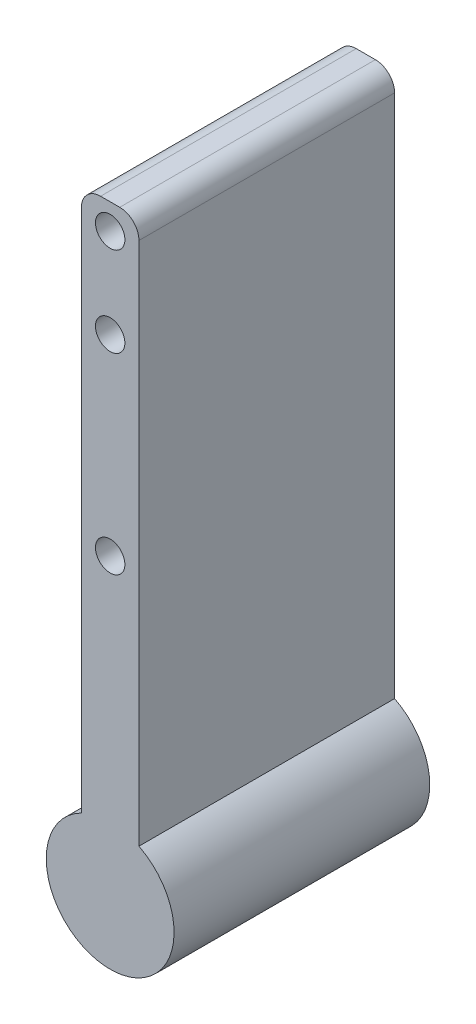
ISO-10303-21;
HEADER;
FILE_DESCRIPTION(('STEP AP214'),'2;1');
FILE_NAME('part.step','',(''),(''),'','','');
FILE_SCHEMA(('AUTOMOTIVE_DESIGN { 1 0 10303 214 1 1 1 1 }'));
ENDSEC;
DATA;
#1=APPLICATION_CONTEXT('core data for automotive mechanical design processes');
#2=APPLICATION_PROTOCOL_DEFINITION('international standard','automotive_design',2000,#1);
#3=PRODUCT_CONTEXT('',#1,'mechanical');
#4=PRODUCT('Part','Part','',(#3));
#5=PRODUCT_RELATED_PRODUCT_CATEGORY('part','',(#4));
#6=PRODUCT_DEFINITION_FORMATION('','',#4);
#7=PRODUCT_DEFINITION_CONTEXT('part definition',#1,'design');
#8=PRODUCT_DEFINITION('design','',#6,#7);
#9=PRODUCT_DEFINITION_SHAPE('','',#8);
#10=(LENGTH_UNIT() NAMED_UNIT(*) SI_UNIT(.MILLI.,.METRE.));
#11=(NAMED_UNIT(*) PLANE_ANGLE_UNIT() SI_UNIT($,.RADIAN.));
#12=(NAMED_UNIT(*) SI_UNIT($,.STERADIAN.) SOLID_ANGLE_UNIT());
#13=UNCERTAINTY_MEASURE_WITH_UNIT(LENGTH_MEASURE(1.E-05),#10,'distance_accuracy_value','');
#14=(GEOMETRIC_REPRESENTATION_CONTEXT(3) GLOBAL_UNCERTAINTY_ASSIGNED_CONTEXT((#13)) GLOBAL_UNIT_ASSIGNED_CONTEXT((#10,
#11,#12)) REPRESENTATION_CONTEXT('',''));
#15=CARTESIAN_POINT('',(0.,0.,0.));
#16=DIRECTION('',(0.,0.,1.));
#17=DIRECTION('',(1.,0.,0.));
#18=AXIS2_PLACEMENT_3D('',#15,#16,#17);
#19=CARTESIAN_POINT('',(-2.25000000000001,0.,10.));
#20=DIRECTION('',(1.,0.,0.));
#21=DIRECTION('',(0.,1.,0.));
#22=AXIS2_PLACEMENT_3D('',#19,#20,#21);
#23=PLANE('',#22);
#24=DIRECTION('',(0.,-1.,0.));
#25=VECTOR('',#24,1.);
#26=CARTESIAN_POINT('',(-2.25000000000001,0.,10.));
#27=LINE('',#26,#25);
#28=CARTESIAN_POINT('',(-2.25000000000001,21.9999999999999,10.));
#29=VERTEX_POINT('',#28);
#30=CARTESIAN_POINT('',(-2.25,-19.0348572251272,10.));
#31=VERTEX_POINT('',#30);
#32=EDGE_CURVE('E96',#29,#31,#27,.T.);
#33=ORIENTED_EDGE('',*,*,#32,.F.);
#34=DIRECTION('',(0.,0.,-1.));
#35=VECTOR('',#34,1.);
#36=CARTESIAN_POINT('',(-2.25000000000001,21.9999999999999,-10.));
#37=LINE('',#36,#35);
#38=CARTESIAN_POINT('',(-2.25000000000001,21.9999999999999,-10.));
#39=VERTEX_POINT('',#38);
#40=EDGE_CURVE('E11',#29,#39,#37,.T.);
#41=ORIENTED_EDGE('',*,*,#40,.T.);
#42=DIRECTION('',(0.,-1.,0.));
#43=VECTOR('',#42,1.);
#44=CARTESIAN_POINT('',(-2.25000000000001,0.,-10.));
#45=LINE('',#44,#43);
#46=CARTESIAN_POINT('',(-2.25,-19.0348572251272,-10.));
#47=VERTEX_POINT('',#46);
#48=EDGE_CURVE('E116',#39,#47,#45,.T.);
#49=ORIENTED_EDGE('',*,*,#48,.T.);
#50=DIRECTION('',(0.,0.,-1.));
#51=VECTOR('',#50,1.);
#52=CARTESIAN_POINT('',(-2.25,-19.0348572251272,10.));
#53=LINE('',#52,#51);
#54=EDGE_CURVE('E110',#31,#47,#53,.T.);
#55=ORIENTED_EDGE('',*,*,#54,.F.);
#56=EDGE_LOOP('',(#33,#41,#49,#55));
#57=FACE_BOUND('',#56,.T.);
#58=ADVANCED_FACE('F43',(#57),#23,.F.);
#59=CARTESIAN_POINT('',(0.,-23.5000000000001,10.));
#60=DIRECTION('',(0.,0.,-1.));
#61=DIRECTION('',(-1.,0.,0.));
#62=AXIS2_PLACEMENT_3D('',#59,#60,#61);
#63=CYLINDRICAL_SURFACE('',#62,5.);
#64=CARTESIAN_POINT('',(0.,-23.5000000000001,-10.));
#65=DIRECTION('',(0.,0.,1.));
#66=DIRECTION('',(1.,0.,0.));
#67=AXIS2_PLACEMENT_3D('',#64,#65,#66);
#68=CIRCLE('',#67,5.);
#69=CARTESIAN_POINT('',(2.25,-19.0348572251272,-10.));
#70=VERTEX_POINT('',#69);
#71=EDGE_CURVE('E149',#47,#70,#68,.T.);
#72=ORIENTED_EDGE('',*,*,#71,.T.);
#73=DIRECTION('',(0.,0.,-1.));
#74=VECTOR('',#73,1.);
#75=CARTESIAN_POINT('',(2.25,-19.0348572251272,10.));
#76=LINE('',#75,#74);
#77=CARTESIAN_POINT('',(2.25,-19.0348572251272,10.));
#78=VERTEX_POINT('',#77);
#79=EDGE_CURVE('E112',#78,#70,#76,.T.);
#80=ORIENTED_EDGE('',*,*,#79,.F.);
#81=CARTESIAN_POINT('',(0.,-23.5000000000001,10.));
#82=DIRECTION('',(0.,0.,1.));
#83=DIRECTION('',(1.,0.,0.));
#84=AXIS2_PLACEMENT_3D('',#81,#82,#83);
#85=CIRCLE('',#84,5.);
#86=EDGE_CURVE('E99',#31,#78,#85,.T.);
#87=ORIENTED_EDGE('',*,*,#86,.F.);
#88=ORIENTED_EDGE('',*,*,#54,.T.);
#89=EDGE_LOOP('',(#72,#80,#87,#88));
#90=FACE_BOUND('',#89,.T.);
#91=ADVANCED_FACE('F109',(#90),#63,.T.);
#92=CARTESIAN_POINT('',(2.25,0.,10.));
#93=DIRECTION('',(1.,0.,0.));
#94=DIRECTION('',(0.,1.,0.));
#95=AXIS2_PLACEMENT_3D('',#92,#93,#94);
#96=PLANE('',#95);
#97=DIRECTION('',(0.,-1.,0.));
#98=VECTOR('',#97,1.);
#99=CARTESIAN_POINT('',(2.25,0.,-10.));
#100=LINE('',#99,#98);
#101=CARTESIAN_POINT('',(2.24999999999999,21.9999999999999,-10.));
#102=VERTEX_POINT('',#101);
#103=EDGE_CURVE('E146',#102,#70,#100,.T.);
#104=ORIENTED_EDGE('',*,*,#103,.F.);
#105=DIRECTION('',(0.,0.,-1.));
#106=VECTOR('',#105,1.);
#107=CARTESIAN_POINT('',(2.24999999999999,21.9999999999999,10.));
#108=LINE('',#107,#106);
#109=CARTESIAN_POINT('',(2.24999999999999,21.9999999999999,10.));
#110=VERTEX_POINT('',#109);
#111=EDGE_CURVE('E66',#102,#110,#108,.F.);
#112=ORIENTED_EDGE('',*,*,#111,.T.);
#113=DIRECTION('',(0.,-1.,0.));
#114=VECTOR('',#113,1.);
#115=CARTESIAN_POINT('',(2.25,0.,10.));
#116=LINE('',#115,#114);
#117=EDGE_CURVE('E113',#110,#78,#116,.T.);
#118=ORIENTED_EDGE('',*,*,#117,.T.);
#119=ORIENTED_EDGE('',*,*,#79,.T.);
#120=EDGE_LOOP('',(#104,#112,#118,#119));
#121=FACE_BOUND('',#120,.T.);
#122=ADVANCED_FACE('F148',(#121),#96,.T.);
#123=CARTESIAN_POINT('',(0.,-0.500000000000098,10.));
#124=DIRECTION('',(0.,0.,-1.));
#125=DIRECTION('',(-1.,0.,0.));
#126=AXIS2_PLACEMENT_3D('',#123,#124,#125);
#127=CYLINDRICAL_SURFACE('',#126,1.15);
#128=CARTESIAN_POINT('',(0.,-0.500000000000098,10.));
#129=DIRECTION('',(0.,0.,1.));
#130=DIRECTION('',(1.,0.,0.));
#131=AXIS2_PLACEMENT_3D('',#128,#129,#130);
#132=CIRCLE('',#131,1.15);
#133=CARTESIAN_POINT('',(1.15,-0.500000000000098,10.));
#134=VERTEX_POINT('',#133);
#135=EDGE_CURVE('E104',#134,#134,#132,.T.);
#136=ORIENTED_EDGE('',*,*,#135,.T.);
#137=EDGE_LOOP('',(#136));
#138=FACE_BOUND('',#137,.T.);
#139=CARTESIAN_POINT('',(0.,-0.500000000000098,-10.));
#140=DIRECTION('',(0.,0.,1.));
#141=DIRECTION('',(1.,0.,0.));
#142=AXIS2_PLACEMENT_3D('',#139,#140,#141);
#143=CIRCLE('',#142,1.15);
#144=CARTESIAN_POINT('',(1.15,-0.500000000000098,-10.));
#145=VERTEX_POINT('',#144);
#146=EDGE_CURVE('E155',#145,#145,#143,.T.);
#147=ORIENTED_EDGE('',*,*,#146,.F.);
#148=EDGE_LOOP('',(#147));
#149=FACE_BOUND('',#148,.T.);
#150=ADVANCED_FACE('F183',(#138,#149),#127,.F.);
#151=CARTESIAN_POINT('',(0.,14.4999999999999,10.));
#152=DIRECTION('',(0.,0.,-1.));
#153=DIRECTION('',(-1.,0.,0.));
#154=AXIS2_PLACEMENT_3D('',#151,#152,#153);
#155=CYLINDRICAL_SURFACE('',#154,1.15);
#156=CARTESIAN_POINT('',(0.,14.4999999999999,10.));
#157=DIRECTION('',(0.,0.,1.));
#158=DIRECTION('',(1.,0.,0.));
#159=AXIS2_PLACEMENT_3D('',#156,#157,#158);
#160=CIRCLE('',#159,1.15);
#161=CARTESIAN_POINT('',(1.15,14.4999999999999,10.));
#162=VERTEX_POINT('',#161);
#163=EDGE_CURVE('E167',#162,#162,#160,.T.);
#164=ORIENTED_EDGE('',*,*,#163,.T.);
#165=EDGE_LOOP('',(#164));
#166=FACE_BOUND('',#165,.T.);
#167=CARTESIAN_POINT('',(0.,14.4999999999999,-10.));
#168=DIRECTION('',(0.,0.,1.));
#169=DIRECTION('',(1.,0.,0.));
#170=AXIS2_PLACEMENT_3D('',#167,#168,#169);
#171=CIRCLE('',#170,1.15);
#172=CARTESIAN_POINT('',(1.15,14.4999999999999,-10.));
#173=VERTEX_POINT('',#172);
#174=EDGE_CURVE('E158',#173,#173,#171,.T.);
#175=ORIENTED_EDGE('',*,*,#174,.F.);
#176=EDGE_LOOP('',(#175));
#177=FACE_BOUND('',#176,.T.);
#178=ADVANCED_FACE('F186',(#166,#177),#155,.F.);
#179=CARTESIAN_POINT('',(0.,21.4999999999999,10.));
#180=DIRECTION('',(0.,0.,-1.));
#181=DIRECTION('',(-1.,0.,0.));
#182=AXIS2_PLACEMENT_3D('',#179,#180,#181);
#183=CYLINDRICAL_SURFACE('',#182,1.15);
#184=CARTESIAN_POINT('',(0.,21.4999999999999,10.));
#185=DIRECTION('',(0.,0.,1.));
#186=DIRECTION('',(1.,0.,0.));
#187=AXIS2_PLACEMENT_3D('',#184,#185,#186);
#188=CIRCLE('',#187,1.15);
#189=CARTESIAN_POINT('',(1.15,21.4999999999999,10.));
#190=VERTEX_POINT('',#189);
#191=EDGE_CURVE('E151',#190,#190,#188,.T.);
#192=ORIENTED_EDGE('',*,*,#191,.T.);
#193=EDGE_LOOP('',(#192));
#194=FACE_BOUND('',#193,.T.);
#195=CARTESIAN_POINT('',(0.,21.4999999999999,-10.));
#196=DIRECTION('',(0.,0.,1.));
#197=DIRECTION('',(1.,0.,0.));
#198=AXIS2_PLACEMENT_3D('',#195,#196,#197);
#199=CIRCLE('',#198,1.15);
#200=CARTESIAN_POINT('',(1.15,21.4999999999999,-10.));
#201=VERTEX_POINT('',#200);
#202=EDGE_CURVE('E161',#201,#201,#199,.T.);
#203=ORIENTED_EDGE('',*,*,#202,.F.);
#204=EDGE_LOOP('',(#203));
#205=FACE_BOUND('',#204,.T.);
#206=ADVANCED_FACE('F173',(#194,#205),#183,.F.);
#207=CARTESIAN_POINT('',(0.,23.4999999999999,10.));
#208=DIRECTION('',(0.,1.,0.));
#209=DIRECTION('',(0.,0.,1.));
#210=AXIS2_PLACEMENT_3D('',#207,#208,#209);
#211=PLANE('',#210);
#212=DIRECTION('',(1.,0.,0.));
#213=VECTOR('',#212,1.);
#214=CARTESIAN_POINT('',(0.,23.4999999999999,10.));
#215=LINE('',#214,#213);
#216=CARTESIAN_POINT('',(-0.750000000000008,23.4999999999999,10.));
#217=VERTEX_POINT('',#216);
#218=CARTESIAN_POINT('',(0.749999999999991,23.4999999999999,10.));
#219=VERTEX_POINT('',#218);
#220=EDGE_CURVE('E122',#217,#219,#215,.T.);
#221=ORIENTED_EDGE('',*,*,#220,.T.);
#222=DIRECTION('',(0.,0.,-1.));
#223=VECTOR('',#222,1.);
#224=CARTESIAN_POINT('',(0.749999999999991,23.4999999999999,10.));
#225=LINE('',#224,#223);
#226=CARTESIAN_POINT('',(0.749999999999991,23.4999999999999,-10.));
#227=VERTEX_POINT('',#226);
#228=EDGE_CURVE('E120',#219,#227,#225,.T.);
#229=ORIENTED_EDGE('',*,*,#228,.T.);
#230=DIRECTION('',(1.,0.,0.));
#231=VECTOR('',#230,1.);
#232=CARTESIAN_POINT('',(0.,23.4999999999999,-10.));
#233=LINE('',#232,#231);
#234=CARTESIAN_POINT('',(-0.750000000000008,23.4999999999999,-10.));
#235=VERTEX_POINT('',#234);
#236=EDGE_CURVE('E147',#235,#227,#233,.T.);
#237=ORIENTED_EDGE('',*,*,#236,.F.);
#238=DIRECTION('',(0.,0.,-1.));
#239=VECTOR('',#238,1.);
#240=CARTESIAN_POINT('',(-0.750000000000008,23.4999999999999,10.));
#241=LINE('',#240,#239);
#242=EDGE_CURVE('E118',#235,#217,#241,.F.);
#243=ORIENTED_EDGE('',*,*,#242,.T.);
#244=EDGE_LOOP('',(#221,#229,#237,#243));
#245=FACE_BOUND('',#244,.T.);
#246=ADVANCED_FACE('F138',(#245),#211,.T.);
#247=CARTESIAN_POINT('',(0.,0.,10.));
#248=DIRECTION('',(0.,0.,1.));
#249=DIRECTION('',(1.,0.,0.));
#250=AXIS2_PLACEMENT_3D('',#247,#248,#249);
#251=PLANE('',#250);
#252=ORIENTED_EDGE('',*,*,#191,.F.);
#253=EDGE_LOOP('',(#252));
#254=FACE_BOUND('',#253,.T.);
#255=ORIENTED_EDGE('',*,*,#163,.F.);
#256=EDGE_LOOP('',(#255));
#257=FACE_BOUND('',#256,.T.);
#258=ORIENTED_EDGE('',*,*,#135,.F.);
#259=EDGE_LOOP('',(#258));
#260=FACE_BOUND('',#259,.T.);
#261=ORIENTED_EDGE('',*,*,#117,.F.);
#262=CARTESIAN_POINT('',(0.749999999999991,21.9999999999999,10.));
#263=DIRECTION('',(0.,0.,1.));
#264=DIRECTION('',(1.,0.,0.));
#265=AXIS2_PLACEMENT_3D('',#262,#263,#264);
#266=CIRCLE('',#265,1.5);
#267=EDGE_CURVE('E51',#110,#219,#266,.T.);
#268=ORIENTED_EDGE('',*,*,#267,.T.);
#269=ORIENTED_EDGE('',*,*,#220,.F.);
#270=CARTESIAN_POINT('',(-0.750000000000008,21.9999999999999,10.));
#271=DIRECTION('',(0.,0.,1.));
#272=DIRECTION('',(1.,0.,0.));
#273=AXIS2_PLACEMENT_3D('',#270,#271,#272);
#274=CIRCLE('',#273,1.5);
#275=EDGE_CURVE('E58',#217,#29,#274,.T.);
#276=ORIENTED_EDGE('',*,*,#275,.T.);
#277=ORIENTED_EDGE('',*,*,#32,.T.);
#278=ORIENTED_EDGE('',*,*,#86,.T.);
#279=EDGE_LOOP('',(#261,#268,#269,#276,#277,#278));
#280=FACE_BOUND('',#279,.T.);
#281=ADVANCED_FACE('F98',(#254,#257,#260,#280),#251,.T.);
#282=CARTESIAN_POINT('',(0.,0.,-10.));
#283=DIRECTION('',(0.,0.,1.));
#284=DIRECTION('',(1.,0.,0.));
#285=AXIS2_PLACEMENT_3D('',#282,#283,#284);
#286=PLANE('',#285);
#287=ORIENTED_EDGE('',*,*,#202,.T.);
#288=EDGE_LOOP('',(#287));
#289=FACE_BOUND('',#288,.T.);
#290=ORIENTED_EDGE('',*,*,#174,.T.);
#291=EDGE_LOOP('',(#290));
#292=FACE_BOUND('',#291,.T.);
#293=ORIENTED_EDGE('',*,*,#146,.T.);
#294=EDGE_LOOP('',(#293));
#295=FACE_BOUND('',#294,.T.);
#296=ORIENTED_EDGE('',*,*,#236,.T.);
#297=CARTESIAN_POINT('',(0.749999999999991,21.9999999999999,-10.));
#298=DIRECTION('',(0.,0.,1.));
#299=DIRECTION('',(1.,0.,0.));
#300=AXIS2_PLACEMENT_3D('',#297,#298,#299);
#301=CIRCLE('',#300,1.5);
#302=EDGE_CURVE('E130',#227,#102,#301,.F.);
#303=ORIENTED_EDGE('',*,*,#302,.T.);
#304=ORIENTED_EDGE('',*,*,#103,.T.);
#305=ORIENTED_EDGE('',*,*,#71,.F.);
#306=ORIENTED_EDGE('',*,*,#48,.F.);
#307=CARTESIAN_POINT('',(-0.750000000000008,21.9999999999999,-10.));
#308=DIRECTION('',(0.,0.,1.));
#309=DIRECTION('',(1.,0.,0.));
#310=AXIS2_PLACEMENT_3D('',#307,#308,#309);
#311=CIRCLE('',#310,1.5);
#312=EDGE_CURVE('E128',#39,#235,#311,.F.);
#313=ORIENTED_EDGE('',*,*,#312,.T.);
#314=EDGE_LOOP('',(#296,#303,#304,#305,#306,#313));
#315=FACE_BOUND('',#314,.T.);
#316=ADVANCED_FACE('F145',(#289,#292,#295,#315),#286,.F.);
#317=CARTESIAN_POINT('',(0.749999999999991,21.9999999999999,10.));
#318=DIRECTION('',(0.,0.,-1.));
#319=DIRECTION('',(-1.,0.,0.));
#320=AXIS2_PLACEMENT_3D('',#317,#318,#319);
#321=CYLINDRICAL_SURFACE('',#320,1.5);
#322=ORIENTED_EDGE('',*,*,#267,.F.);
#323=ORIENTED_EDGE('',*,*,#111,.F.);
#324=ORIENTED_EDGE('',*,*,#302,.F.);
#325=ORIENTED_EDGE('',*,*,#228,.F.);
#326=EDGE_LOOP('',(#322,#323,#324,#325));
#327=FACE_BOUND('',#326,.T.);
#328=ADVANCED_FACE('F143',(#327),#321,.T.);
#329=CARTESIAN_POINT('',(-0.750000000000008,21.9999999999999,10.));
#330=DIRECTION('',(0.,0.,1.));
#331=DIRECTION('',(1.,0.,0.));
#332=AXIS2_PLACEMENT_3D('',#329,#330,#331);
#333=CYLINDRICAL_SURFACE('',#332,1.5);
#334=ORIENTED_EDGE('',*,*,#275,.F.);
#335=ORIENTED_EDGE('',*,*,#242,.F.);
#336=ORIENTED_EDGE('',*,*,#312,.F.);
#337=ORIENTED_EDGE('',*,*,#40,.F.);
#338=EDGE_LOOP('',(#334,#335,#336,#337));
#339=FACE_BOUND('',#338,.T.);
#340=ADVANCED_FACE('F45',(#339),#333,.T.);
#341=CLOSED_SHELL('',(#58,#91,#122,#150,#178,#206,#246,#281,#316,#328,#340));
#342=MANIFOLD_SOLID_BREP('B2',#341);
#343=ADVANCED_BREP_SHAPE_REPRESENTATION('',(#18,#342),#14);
#344=SHAPE_DEFINITION_REPRESENTATION(#9,#343);
ENDSEC;
END-ISO-10303-21;
